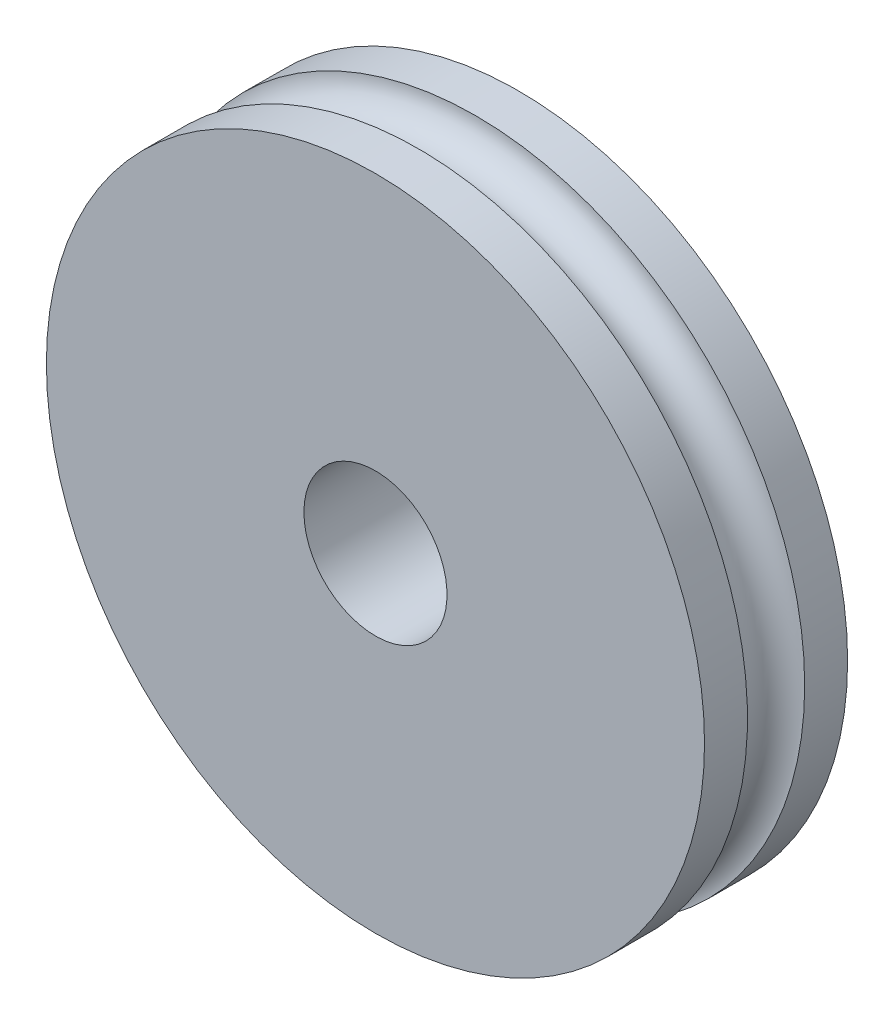
ISO-10303-21;
HEADER;
FILE_DESCRIPTION(('STEP AP214'),'2;1');
FILE_NAME('part.step','',(''),(''),'','','');
FILE_SCHEMA(('AUTOMOTIVE_DESIGN { 1 0 10303 214 1 1 1 1 }'));
ENDSEC;
DATA;
#1=APPLICATION_CONTEXT('core data for automotive mechanical design processes');
#2=APPLICATION_PROTOCOL_DEFINITION('international standard','automotive_design',2000,#1);
#3=PRODUCT_CONTEXT('',#1,'mechanical');
#4=PRODUCT('Part','Part','',(#3));
#5=PRODUCT_RELATED_PRODUCT_CATEGORY('part','',(#4));
#6=PRODUCT_DEFINITION_FORMATION('','',#4);
#7=PRODUCT_DEFINITION_CONTEXT('part definition',#1,'design');
#8=PRODUCT_DEFINITION('design','',#6,#7);
#9=PRODUCT_DEFINITION_SHAPE('','',#8);
#10=(LENGTH_UNIT() NAMED_UNIT(*) SI_UNIT(.MILLI.,.METRE.));
#11=(NAMED_UNIT(*) PLANE_ANGLE_UNIT() SI_UNIT($,.RADIAN.));
#12=(NAMED_UNIT(*) SI_UNIT($,.STERADIAN.) SOLID_ANGLE_UNIT());
#13=UNCERTAINTY_MEASURE_WITH_UNIT(LENGTH_MEASURE(1.E-05),#10,'distance_accuracy_value','');
#14=(GEOMETRIC_REPRESENTATION_CONTEXT(3) GLOBAL_UNCERTAINTY_ASSIGNED_CONTEXT((#13)) GLOBAL_UNIT_ASSIGNED_CONTEXT((#10,
#11,#12)) REPRESENTATION_CONTEXT('',''));
#15=CARTESIAN_POINT('',(0.,0.,0.));
#16=DIRECTION('',(0.,0.,1.));
#17=DIRECTION('',(1.,0.,0.));
#18=AXIS2_PLACEMENT_3D('',#15,#16,#17);
#19=CARTESIAN_POINT('',(0.,0.,50.));
#20=DIRECTION('',(0.,0.,-1.));
#21=DIRECTION('',(-1.,0.,0.));
#22=AXIS2_PLACEMENT_3D('',#19,#20,#21);
#23=CYLINDRICAL_SURFACE('',#22,115.);
#24=CARTESIAN_POINT('',(0.,0.,15.));
#25=DIRECTION('',(0.,0.,1.));
#26=DIRECTION('',(1.,0.,0.));
#27=AXIS2_PLACEMENT_3D('',#24,#25,#26);
#28=CIRCLE('',#27,115.);
#29=CARTESIAN_POINT('',(115.,0.,15.));
#30=VERTEX_POINT('',#29);
#31=EDGE_CURVE('E34',#30,#30,#28,.F.);
#32=ORIENTED_EDGE('',*,*,#31,.T.);
#33=EDGE_LOOP('',(#32));
#34=FACE_BOUND('',#33,.T.);
#35=CARTESIAN_POINT('',(0.,0.,0.));
#36=DIRECTION('',(0.,0.,1.));
#37=DIRECTION('',(1.,0.,0.));
#38=AXIS2_PLACEMENT_3D('',#35,#36,#37);
#39=CIRCLE('',#38,115.);
#40=CARTESIAN_POINT('',(115.,0.,0.));
#41=VERTEX_POINT('',#40);
#42=EDGE_CURVE('E38',#41,#41,#39,.T.);
#43=ORIENTED_EDGE('',*,*,#42,.T.);
#44=EDGE_LOOP('',(#43));
#45=FACE_BOUND('',#44,.T.);
#46=ADVANCED_FACE('F30',(#34,#45),#23,.T.);
#47=CARTESIAN_POINT('',(0.,0.,0.));
#48=DIRECTION('',(0.,0.,1.));
#49=DIRECTION('',(1.,0.,0.));
#50=AXIS2_PLACEMENT_3D('',#47,#48,#49);
#51=PLANE('',#50);
#52=CARTESIAN_POINT('',(0.,0.,0.));
#53=DIRECTION('',(0.,0.,-1.));
#54=DIRECTION('',(-1.,0.,0.));
#55=AXIS2_PLACEMENT_3D('',#52,#53,#54);
#56=CIRCLE('',#55,25.);
#57=CARTESIAN_POINT('',(-25.,0.,0.));
#58=VERTEX_POINT('',#57);
#59=EDGE_CURVE('E45',#58,#58,#56,.T.);
#60=ORIENTED_EDGE('',*,*,#59,.F.);
#61=EDGE_LOOP('',(#60));
#62=FACE_BOUND('',#61,.T.);
#63=ORIENTED_EDGE('',*,*,#42,.F.);
#64=EDGE_LOOP('',(#63));
#65=FACE_BOUND('',#64,.T.);
#66=ADVANCED_FACE('F61',(#62,#65),#51,.F.);
#67=CARTESIAN_POINT('',(0.,0.,25.));
#68=DIRECTION('',(0.,0.,-1.));
#69=DIRECTION('',(-1.,0.,0.));
#70=AXIS2_PLACEMENT_3D('',#67,#68,#69);
#71=TOROIDAL_SURFACE('',#70,115.,10.);
#72=CARTESIAN_POINT('',(0.,0.,35.));
#73=DIRECTION('',(0.,0.,-1.));
#74=DIRECTION('',(-1.,0.,0.));
#75=AXIS2_PLACEMENT_3D('',#72,#73,#74);
#76=CIRCLE('',#75,115.);
#77=CARTESIAN_POINT('',(-115.,0.,35.));
#78=VERTEX_POINT('',#77);
#79=EDGE_CURVE('E47',#78,#78,#76,.F.);
#80=ORIENTED_EDGE('',*,*,#79,.F.);
#81=EDGE_LOOP('',(#80));
#82=FACE_BOUND('',#81,.T.);
#83=ORIENTED_EDGE('',*,*,#31,.F.);
#84=EDGE_LOOP('',(#83));
#85=FACE_BOUND('',#84,.T.);
#86=ADVANCED_FACE('F64',(#82,#85),#71,.F.);
#87=CARTESIAN_POINT('',(0.,0.,50.));
#88=DIRECTION('',(0.,0.,1.));
#89=DIRECTION('',(1.,0.,0.));
#90=AXIS2_PLACEMENT_3D('',#87,#88,#89);
#91=PLANE('',#90);
#92=CARTESIAN_POINT('',(0.,0.,50.));
#93=DIRECTION('',(0.,0.,-1.));
#94=DIRECTION('',(-1.,0.,0.));
#95=AXIS2_PLACEMENT_3D('',#92,#93,#94);
#96=CIRCLE('',#95,25.);
#97=CARTESIAN_POINT('',(-25.,0.,50.));
#98=VERTEX_POINT('',#97);
#99=EDGE_CURVE('E49',#98,#98,#96,.T.);
#100=ORIENTED_EDGE('',*,*,#99,.T.);
#101=EDGE_LOOP('',(#100));
#102=FACE_BOUND('',#101,.T.);
#103=CARTESIAN_POINT('',(0.,0.,50.));
#104=DIRECTION('',(0.,0.,1.));
#105=DIRECTION('',(1.,0.,0.));
#106=AXIS2_PLACEMENT_3D('',#103,#104,#105);
#107=CIRCLE('',#106,115.);
#108=CARTESIAN_POINT('',(115.,0.,50.));
#109=VERTEX_POINT('',#108);
#110=EDGE_CURVE('E10',#109,#109,#107,.T.);
#111=ORIENTED_EDGE('',*,*,#110,.T.);
#112=EDGE_LOOP('',(#111));
#113=FACE_BOUND('',#112,.T.);
#114=ADVANCED_FACE('F72',(#102,#113),#91,.T.);
#115=ORIENTED_EDGE('',*,*,#79,.T.);
#116=EDGE_LOOP('',(#115));
#117=FACE_BOUND('',#116,.T.);
#118=ORIENTED_EDGE('',*,*,#110,.F.);
#119=EDGE_LOOP('',(#118));
#120=FACE_BOUND('',#119,.T.);
#121=ADVANCED_FACE('F32',(#117,#120),#23,.T.);
#122=CARTESIAN_POINT('',(0.,0.,50.));
#123=DIRECTION('',(0.,0.,-1.));
#124=DIRECTION('',(-1.,0.,0.));
#125=AXIS2_PLACEMENT_3D('',#122,#123,#124);
#126=CYLINDRICAL_SURFACE('',#125,25.);
#127=ORIENTED_EDGE('',*,*,#99,.F.);
#128=EDGE_LOOP('',(#127));
#129=FACE_BOUND('',#128,.T.);
#130=ORIENTED_EDGE('',*,*,#59,.T.);
#131=EDGE_LOOP('',(#130));
#132=FACE_BOUND('',#131,.T.);
#133=ADVANCED_FACE('F59',(#129,#132),#126,.F.);
#134=CLOSED_SHELL('',(#46,#66,#86,#114,#121,#133));
#135=MANIFOLD_SOLID_BREP('B2',#134);
#136=ADVANCED_BREP_SHAPE_REPRESENTATION('',(#18,#135),#14);
#137=SHAPE_DEFINITION_REPRESENTATION(#9,#136);
ENDSEC;
END-ISO-10303-21;
